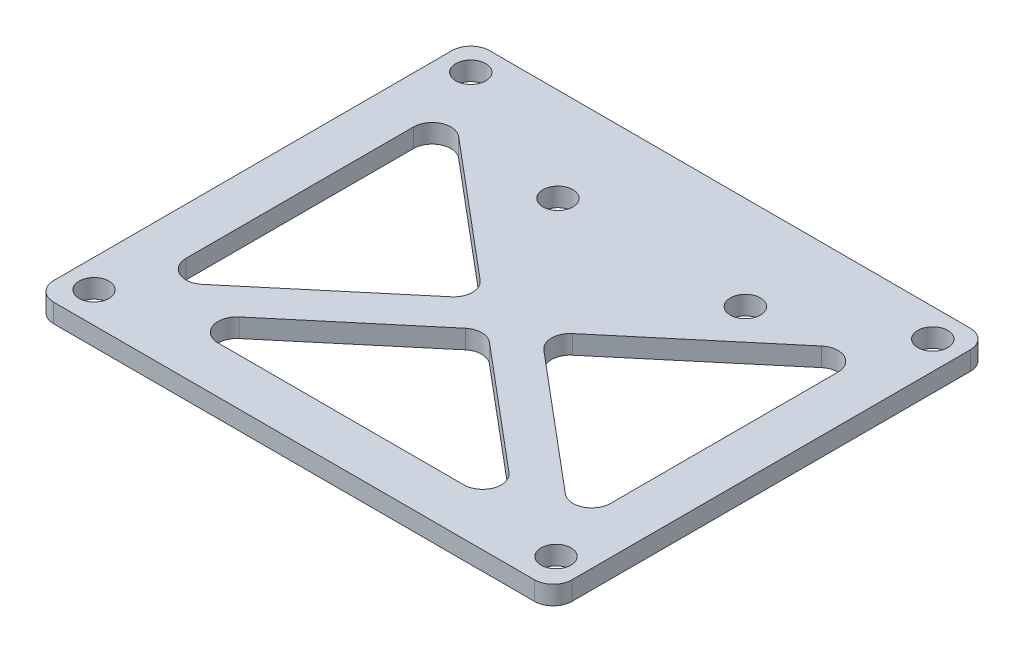
ISO-10303-21;
HEADER;
FILE_DESCRIPTION(('STEP AP214'),'2;1');
FILE_NAME('part.step','',(''),(''),'','','');
FILE_SCHEMA(('AUTOMOTIVE_DESIGN { 1 0 10303 214 1 1 1 1 }'));
ENDSEC;
DATA;
#1=APPLICATION_CONTEXT('core data for automotive mechanical design processes');
#2=APPLICATION_PROTOCOL_DEFINITION('international standard','automotive_design',2000,#1);
#3=PRODUCT_CONTEXT('',#1,'mechanical');
#4=PRODUCT('Part','Part','',(#3));
#5=PRODUCT_RELATED_PRODUCT_CATEGORY('part','',(#4));
#6=PRODUCT_DEFINITION_FORMATION('','',#4);
#7=PRODUCT_DEFINITION_CONTEXT('part definition',#1,'design');
#8=PRODUCT_DEFINITION('design','',#6,#7);
#9=PRODUCT_DEFINITION_SHAPE('','',#8);
#10=(LENGTH_UNIT() NAMED_UNIT(*) SI_UNIT(.MILLI.,.METRE.));
#11=(NAMED_UNIT(*) PLANE_ANGLE_UNIT() SI_UNIT($,.RADIAN.));
#12=(NAMED_UNIT(*) SI_UNIT($,.STERADIAN.) SOLID_ANGLE_UNIT());
#13=UNCERTAINTY_MEASURE_WITH_UNIT(LENGTH_MEASURE(1.E-05),#10,'distance_accuracy_value','');
#14=(GEOMETRIC_REPRESENTATION_CONTEXT(3) GLOBAL_UNCERTAINTY_ASSIGNED_CONTEXT((#13)) GLOBAL_UNIT_ASSIGNED_CONTEXT((#10,
#11,#12)) REPRESENTATION_CONTEXT('',''));
#15=CARTESIAN_POINT('',(0.,0.,0.));
#16=DIRECTION('',(0.,0.,1.));
#17=DIRECTION('',(1.,0.,0.));
#18=AXIS2_PLACEMENT_3D('',#15,#16,#17);
#19=CARTESIAN_POINT('',(0.,2.,0.));
#20=DIRECTION('',(0.,1.,0.));
#21=DIRECTION('',(0.,0.,1.));
#22=AXIS2_PLACEMENT_3D('',#19,#20,#21);
#23=PLANE('',#22);
#24=CARTESIAN_POINT('',(-24.6499999999996,2.,19.9500000000004));
#25=DIRECTION('',(0.,1.,0.));
#26=DIRECTION('',(0.,0.,1.));
#27=AXIS2_PLACEMENT_3D('',#24,#25,#26);
#28=CIRCLE('',#27,1.6);
#29=CARTESIAN_POINT('',(-24.6499999999996,2.,21.5500000000004));
#30=VERTEX_POINT('',#29);
#31=EDGE_CURVE('E396',#30,#30,#28,.T.);
#32=ORIENTED_EDGE('',*,*,#31,.F.);
#33=EDGE_LOOP('',(#32));
#34=FACE_BOUND('',#33,.T.);
#35=CARTESIAN_POINT('',(24.65,2.,-20.25));
#36=DIRECTION('',(0.,1.,0.));
#37=DIRECTION('',(0.,0.,1.));
#38=AXIS2_PLACEMENT_3D('',#35,#36,#37);
#39=CIRCLE('',#38,1.6);
#40=CARTESIAN_POINT('',(24.65,2.,-18.65));
#41=VERTEX_POINT('',#40);
#42=EDGE_CURVE('E408',#41,#41,#39,.T.);
#43=ORIENTED_EDGE('',*,*,#42,.F.);
#44=EDGE_LOOP('',(#43));
#45=FACE_BOUND('',#44,.T.);
#46=CARTESIAN_POINT('',(11.65,2.,-13.25));
#47=DIRECTION('',(0.,1.,0.));
#48=DIRECTION('',(0.,0.,1.));
#49=AXIS2_PLACEMENT_3D('',#46,#47,#48);
#50=CIRCLE('',#49,1.6);
#51=CARTESIAN_POINT('',(11.65,2.,-11.65));
#52=VERTEX_POINT('',#51);
#53=EDGE_CURVE('E420',#52,#52,#50,.T.);
#54=ORIENTED_EDGE('',*,*,#53,.F.);
#55=EDGE_LOOP('',(#54));
#56=FACE_BOUND('',#55,.T.);
#57=DIRECTION('',(0.,0.,1.));
#58=VECTOR('',#57,1.);
#59=CARTESIAN_POINT('',(-27.65,2.,-23.25));
#60=LINE('',#59,#58);
#61=CARTESIAN_POINT('',(-27.65,2.,-21.25));
#62=VERTEX_POINT('',#61);
#63=CARTESIAN_POINT('',(-27.65,2.,21.25));
#64=VERTEX_POINT('',#63);
#65=EDGE_CURVE('E242',#62,#64,#60,.T.);
#66=ORIENTED_EDGE('',*,*,#65,.T.);
#67=CARTESIAN_POINT('',(-25.65,2.,21.25));
#68=DIRECTION('',(0.,1.,0.));
#69=DIRECTION('',(0.,0.,1.));
#70=AXIS2_PLACEMENT_3D('',#67,#68,#69);
#71=CIRCLE('',#70,2.);
#72=CARTESIAN_POINT('',(-25.65,2.,23.25));
#73=VERTEX_POINT('',#72);
#74=EDGE_CURVE('E309',#64,#73,#71,.T.);
#75=ORIENTED_EDGE('',*,*,#74,.T.);
#76=DIRECTION('',(1.,0.,0.));
#77=VECTOR('',#76,1.);
#78=CARTESIAN_POINT('',(-27.65,2.,23.25));
#79=LINE('',#78,#77);
#80=CARTESIAN_POINT('',(25.65,2.,23.25));
#81=VERTEX_POINT('',#80);
#82=EDGE_CURVE('E237',#73,#81,#79,.T.);
#83=ORIENTED_EDGE('',*,*,#82,.T.);
#84=CARTESIAN_POINT('',(25.65,2.,21.25));
#85=DIRECTION('',(0.,1.,0.));
#86=DIRECTION('',(0.,0.,1.));
#87=AXIS2_PLACEMENT_3D('',#84,#85,#86);
#88=CIRCLE('',#87,2.);
#89=CARTESIAN_POINT('',(27.65,2.,21.25));
#90=VERTEX_POINT('',#89);
#91=EDGE_CURVE('E304',#81,#90,#88,.T.);
#92=ORIENTED_EDGE('',*,*,#91,.T.);
#93=DIRECTION('',(0.,0.,-1.));
#94=VECTOR('',#93,1.);
#95=CARTESIAN_POINT('',(27.65,2.,-23.25));
#96=LINE('',#95,#94);
#97=CARTESIAN_POINT('',(27.65,2.,-21.25));
#98=VERTEX_POINT('',#97);
#99=EDGE_CURVE('E426',#90,#98,#96,.T.);
#100=ORIENTED_EDGE('',*,*,#99,.T.);
#101=CARTESIAN_POINT('',(25.65,2.,-21.25));
#102=DIRECTION('',(0.,1.,0.));
#103=DIRECTION('',(0.,0.,1.));
#104=AXIS2_PLACEMENT_3D('',#101,#102,#103);
#105=CIRCLE('',#104,2.);
#106=CARTESIAN_POINT('',(25.65,2.,-23.25));
#107=VERTEX_POINT('',#106);
#108=EDGE_CURVE('E59',#98,#107,#105,.T.);
#109=ORIENTED_EDGE('',*,*,#108,.T.);
#110=DIRECTION('',(-1.,0.,0.));
#111=VECTOR('',#110,1.);
#112=CARTESIAN_POINT('',(-27.65,2.,-23.25));
#113=LINE('',#112,#111);
#114=CARTESIAN_POINT('',(-25.65,2.,-23.25));
#115=VERTEX_POINT('',#114);
#116=EDGE_CURVE('E428',#107,#115,#113,.T.);
#117=ORIENTED_EDGE('',*,*,#116,.T.);
#118=CARTESIAN_POINT('',(-25.65,2.,-21.25));
#119=DIRECTION('',(0.,1.,0.));
#120=DIRECTION('',(0.,0.,1.));
#121=AXIS2_PLACEMENT_3D('',#118,#119,#120);
#122=CIRCLE('',#121,2.);
#123=EDGE_CURVE('E307',#115,#62,#122,.T.);
#124=ORIENTED_EDGE('',*,*,#123,.T.);
#125=EDGE_LOOP('',(#66,#75,#83,#92,#100,#109,#117,#124));
#126=FACE_BOUND('',#125,.T.);
#127=CARTESIAN_POINT('',(-8.35000000000001,2.,-13.25));
#128=DIRECTION('',(0.,1.,0.));
#129=DIRECTION('',(0.,0.,1.));
#130=AXIS2_PLACEMENT_3D('',#127,#128,#129);
#131=CIRCLE('',#130,1.6);
#132=CARTESIAN_POINT('',(-8.35000000000001,2.,-11.65));
#133=VERTEX_POINT('',#132);
#134=EDGE_CURVE('E414',#133,#133,#131,.T.);
#135=ORIENTED_EDGE('',*,*,#134,.F.);
#136=EDGE_LOOP('',(#135));
#137=FACE_BOUND('',#136,.T.);
#138=CARTESIAN_POINT('',(-24.65,2.,-20.2499999999997));
#139=DIRECTION('',(0.,1.,0.));
#140=DIRECTION('',(0.,0.,1.));
#141=AXIS2_PLACEMENT_3D('',#138,#139,#140);
#142=CIRCLE('',#141,1.6);
#143=CARTESIAN_POINT('',(-24.65,2.,-18.6499999999997));
#144=VERTEX_POINT('',#143);
#145=EDGE_CURVE('E402',#144,#144,#142,.T.);
#146=ORIENTED_EDGE('',*,*,#145,.F.);
#147=EDGE_LOOP('',(#146));
#148=FACE_BOUND('',#147,.T.);
#149=CARTESIAN_POINT('',(24.6500000000004,2.,19.95));
#150=DIRECTION('',(0.,1.,0.));
#151=DIRECTION('',(0.,0.,1.));
#152=AXIS2_PLACEMENT_3D('',#149,#150,#151);
#153=CIRCLE('',#152,1.6);
#154=CARTESIAN_POINT('',(24.6500000000004,2.,21.55));
#155=VERTEX_POINT('',#154);
#156=EDGE_CURVE('E390',#155,#155,#153,.T.);
#157=ORIENTED_EDGE('',*,*,#156,.F.);
#158=EDGE_LOOP('',(#157));
#159=FACE_BOUND('',#158,.T.);
#160=DIRECTION('',(-0.765377580301395,0.,-0.643581509656689));
#161=VECTOR('',#160,1.);
#162=CARTESIAN_POINT('',(-3.10760947912701,2.,0.));
#163=LINE('',#162,#161);
#164=CARTESIAN_POINT('',(-4.92805593894065,2.,-1.53075516060279));
#165=VERTEX_POINT('',#164);
#166=CARTESIAN_POINT('',(-19.3628369806866,2.,-13.6685005212029));
#167=VERTEX_POINT('',#166);
#168=EDGE_CURVE('E373',#165,#167,#163,.T.);
#169=ORIENTED_EDGE('',*,*,#168,.F.);
#170=CARTESIAN_POINT('',(-6.21521895825403,2.,0.));
#171=DIRECTION('',(0.,1.,0.));
#172=DIRECTION('',(0.,0.,1.));
#173=AXIS2_PLACEMENT_3D('',#170,#171,#172);
#174=CIRCLE('',#173,2.);
#175=CARTESIAN_POINT('',(-4.92805593894065,2.,1.53075516060279));
#176=VERTEX_POINT('',#175);
#177=EDGE_CURVE('E11',#165,#176,#174,.F.);
#178=ORIENTED_EDGE('',*,*,#177,.T.);
#179=DIRECTION('',(0.765377580301395,0.,-0.643581509656689));
#180=VECTOR('',#179,1.);
#181=CARTESIAN_POINT('',(-3.10760947912701,2.,0.));
#182=LINE('',#181,#180);
#183=CARTESIAN_POINT('',(-19.3628369806866,2.,13.6685005212029));
#184=VERTEX_POINT('',#183);
#185=EDGE_CURVE('E371',#184,#176,#182,.T.);
#186=ORIENTED_EDGE('',*,*,#185,.F.);
#187=CARTESIAN_POINT('',(-20.65,2.,12.1377453606002));
#188=DIRECTION('',(0.,1.,0.));
#189=DIRECTION('',(0.,0.,1.));
#190=AXIS2_PLACEMENT_3D('',#187,#188,#189);
#191=CIRCLE('',#190,2.);
#192=CARTESIAN_POINT('',(-22.65,2.,12.1377453606002));
#193=VERTEX_POINT('',#192);
#194=EDGE_CURVE('E346',#184,#193,#191,.F.);
#195=ORIENTED_EDGE('',*,*,#194,.T.);
#196=DIRECTION('',(0.,0.,1.));
#197=VECTOR('',#196,1.);
#198=CARTESIAN_POINT('',(-22.65,2.,-16.43257069115));
#199=LINE('',#198,#197);
#200=CARTESIAN_POINT('',(-22.65,2.,-12.1377453606002));
#201=VERTEX_POINT('',#200);
#202=EDGE_CURVE('E378',#201,#193,#199,.T.);
#203=ORIENTED_EDGE('',*,*,#202,.F.);
#204=CARTESIAN_POINT('',(-20.65,2.,-12.1377453606002));
#205=DIRECTION('',(0.,1.,0.));
#206=DIRECTION('',(0.,0.,1.));
#207=AXIS2_PLACEMENT_3D('',#204,#205,#206);
#208=CIRCLE('',#207,2.);
#209=EDGE_CURVE('E342',#201,#167,#208,.F.);
#210=ORIENTED_EDGE('',*,*,#209,.T.);
#211=EDGE_LOOP('',(#169,#178,#186,#195,#203,#210));
#212=FACE_BOUND('',#211,.T.);
#213=DIRECTION('',(-0.765377580301395,0.,0.643581509656688));
#214=VECTOR('',#213,1.);
#215=CARTESIAN_POINT('',(0.,2.,2.61308934501639));
#216=LINE('',#215,#214);
#217=CARTESIAN_POINT('',(-1.28716301931337,2.,3.69542352942999));
#218=VERTEX_POINT('',#217);
#219=CARTESIAN_POINT('',(-14.3972128782636,2.,14.7192448393972));
#220=VERTEX_POINT('',#219);
#221=EDGE_CURVE('E832',#218,#220,#216,.T.);
#222=ORIENTED_EDGE('',*,*,#221,.F.);
#223=CARTESIAN_POINT('',(0.,2.,5.22617869003278));
#224=DIRECTION('',(0.,1.,0.));
#225=DIRECTION('',(0.,0.,1.));
#226=AXIS2_PLACEMENT_3D('',#223,#224,#225);
#227=CIRCLE('',#226,2.);
#228=CARTESIAN_POINT('',(1.28716301931338,2.,3.69542352942999));
#229=VERTEX_POINT('',#228);
#230=EDGE_CURVE('E338',#218,#229,#227,.F.);
#231=ORIENTED_EDGE('',*,*,#230,.T.);
#232=DIRECTION('',(-0.765377580301395,0.,-0.643581509656688));
#233=VECTOR('',#232,1.);
#234=CARTESIAN_POINT('',(0.,2.,2.61308934501639));
#235=LINE('',#234,#233);
#236=CARTESIAN_POINT('',(14.3972128782637,2.,14.7192448393972));
#237=VERTEX_POINT('',#236);
#238=EDGE_CURVE('E829',#237,#229,#235,.T.);
#239=ORIENTED_EDGE('',*,*,#238,.F.);
#240=CARTESIAN_POINT('',(13.1100498589503,2.,16.25));
#241=DIRECTION('',(0.,1.,0.));
#242=DIRECTION('',(0.,0.,1.));
#243=AXIS2_PLACEMENT_3D('',#240,#241,#242);
#244=CIRCLE('',#243,2.);
#245=CARTESIAN_POINT('',(13.1100498589503,2.,18.25));
#246=VERTEX_POINT('',#245);
#247=EDGE_CURVE('E334',#237,#246,#244,.F.);
#248=ORIENTED_EDGE('',*,*,#247,.T.);
#249=DIRECTION('',(1.,0.,0.));
#250=VECTOR('',#249,1.);
#251=CARTESIAN_POINT('',(-18.5961539617332,2.,18.25));
#252=LINE('',#251,#250);
#253=CARTESIAN_POINT('',(-13.1100498589503,2.,18.25));
#254=VERTEX_POINT('',#253);
#255=EDGE_CURVE('E388',#254,#246,#252,.T.);
#256=ORIENTED_EDGE('',*,*,#255,.F.);
#257=CARTESIAN_POINT('',(-13.1100498589503,2.,16.25));
#258=DIRECTION('',(0.,1.,0.));
#259=DIRECTION('',(0.,0.,1.));
#260=AXIS2_PLACEMENT_3D('',#257,#258,#259);
#261=CIRCLE('',#260,2.);
#262=EDGE_CURVE('E330',#254,#220,#261,.F.);
#263=ORIENTED_EDGE('',*,*,#262,.T.);
#264=EDGE_LOOP('',(#222,#231,#239,#248,#256,#263));
#265=FACE_BOUND('',#264,.T.);
#266=DIRECTION('',(0.,0.,-1.));
#267=VECTOR('',#266,1.);
#268=CARTESIAN_POINT('',(22.65,2.,-16.43257069115));
#269=LINE('',#268,#267);
#270=CARTESIAN_POINT('',(22.65,2.,12.1377453606002));
#271=VERTEX_POINT('',#270);
#272=CARTESIAN_POINT('',(22.65,2.,-12.1377453606002));
#273=VERTEX_POINT('',#272);
#274=EDGE_CURVE('E820',#271,#273,#269,.T.);
#275=ORIENTED_EDGE('',*,*,#274,.F.);
#276=CARTESIAN_POINT('',(20.65,2.,12.1377453606002));
#277=DIRECTION('',(0.,1.,0.));
#278=DIRECTION('',(0.,0.,1.));
#279=AXIS2_PLACEMENT_3D('',#276,#277,#278);
#280=CIRCLE('',#279,2.);
#281=CARTESIAN_POINT('',(19.3628369806866,2.,13.6685005212029));
#282=VERTEX_POINT('',#281);
#283=EDGE_CURVE('E222',#271,#282,#280,.F.);
#284=ORIENTED_EDGE('',*,*,#283,.T.);
#285=DIRECTION('',(0.765377580301394,0.,0.643581509656689));
#286=VECTOR('',#285,1.);
#287=CARTESIAN_POINT('',(3.10760947912702,2.,0.));
#288=LINE('',#287,#286);
#289=CARTESIAN_POINT('',(4.92805593894066,2.,1.53075516060279));
#290=VERTEX_POINT('',#289);
#291=EDGE_CURVE('E816',#290,#282,#288,.T.);
#292=ORIENTED_EDGE('',*,*,#291,.F.);
#293=CARTESIAN_POINT('',(6.21521895825404,2.,0.));
#294=DIRECTION('',(0.,1.,0.));
#295=DIRECTION('',(0.,0.,1.));
#296=AXIS2_PLACEMENT_3D('',#293,#294,#295);
#297=CIRCLE('',#296,2.);
#298=CARTESIAN_POINT('',(4.92805593894066,2.,-1.53075516060279));
#299=VERTEX_POINT('',#298);
#300=EDGE_CURVE('E223',#290,#299,#297,.F.);
#301=ORIENTED_EDGE('',*,*,#300,.T.);
#302=DIRECTION('',(-0.765377580301394,0.,0.643581509656689));
#303=VECTOR('',#302,1.);
#304=CARTESIAN_POINT('',(3.10760947912702,2.,0.));
#305=LINE('',#304,#303);
#306=CARTESIAN_POINT('',(19.3628369806866,2.,-13.6685005212029));
#307=VERTEX_POINT('',#306);
#308=EDGE_CURVE('E821',#307,#299,#305,.T.);
#309=ORIENTED_EDGE('',*,*,#308,.F.);
#310=CARTESIAN_POINT('',(20.65,2.,-12.1377453606002));
#311=DIRECTION('',(0.,1.,0.));
#312=DIRECTION('',(0.,0.,1.));
#313=AXIS2_PLACEMENT_3D('',#310,#311,#312);
#314=CIRCLE('',#313,2.);
#315=EDGE_CURVE('E322',#307,#273,#314,.F.);
#316=ORIENTED_EDGE('',*,*,#315,.T.);
#317=EDGE_LOOP('',(#275,#284,#292,#301,#309,#316));
#318=FACE_BOUND('',#317,.T.);
#319=ADVANCED_FACE('F37',(#34,#45,#56,#126,#137,#148,#159,#212,#265,#318),#23,.T.);
#320=CARTESIAN_POINT('',(0.,0.,0.));
#321=DIRECTION('',(0.,1.,0.));
#322=DIRECTION('',(0.,0.,1.));
#323=AXIS2_PLACEMENT_3D('',#320,#321,#322);
#324=PLANE('',#323);
#325=DIRECTION('',(1.,0.,0.));
#326=VECTOR('',#325,1.);
#327=CARTESIAN_POINT('',(-18.5961539617332,0.,18.25));
#328=LINE('',#327,#326);
#329=CARTESIAN_POINT('',(-13.1100498589503,0.,18.25));
#330=VERTEX_POINT('',#329);
#331=CARTESIAN_POINT('',(13.1100498589503,0.,18.25));
#332=VERTEX_POINT('',#331);
#333=EDGE_CURVE('E382',#330,#332,#328,.T.);
#334=ORIENTED_EDGE('',*,*,#333,.T.);
#335=CARTESIAN_POINT('',(13.1100498589503,0.,16.25));
#336=DIRECTION('',(0.,1.,0.));
#337=DIRECTION('',(0.,0.,1.));
#338=AXIS2_PLACEMENT_3D('',#335,#336,#337);
#339=CIRCLE('',#338,2.);
#340=CARTESIAN_POINT('',(14.3972128782637,0.,14.7192448393972));
#341=VERTEX_POINT('',#340);
#342=EDGE_CURVE('E332',#332,#341,#339,.T.);
#343=ORIENTED_EDGE('',*,*,#342,.T.);
#344=DIRECTION('',(-0.765377580301395,0.,-0.643581509656688));
#345=VECTOR('',#344,1.);
#346=CARTESIAN_POINT('',(0.,0.,2.61308934501639));
#347=LINE('',#346,#345);
#348=CARTESIAN_POINT('',(1.28716301931338,0.,3.69542352942999));
#349=VERTEX_POINT('',#348);
#350=EDGE_CURVE('E823',#341,#349,#347,.T.);
#351=ORIENTED_EDGE('',*,*,#350,.T.);
#352=CARTESIAN_POINT('',(0.,0.,5.22617869003278));
#353=DIRECTION('',(0.,1.,0.));
#354=DIRECTION('',(0.,0.,1.));
#355=AXIS2_PLACEMENT_3D('',#352,#353,#354);
#356=CIRCLE('',#355,2.);
#357=CARTESIAN_POINT('',(-1.28716301931337,0.,3.69542352942999));
#358=VERTEX_POINT('',#357);
#359=EDGE_CURVE('E336',#349,#358,#356,.T.);
#360=ORIENTED_EDGE('',*,*,#359,.T.);
#361=DIRECTION('',(-0.765377580301395,0.,0.643581509656688));
#362=VECTOR('',#361,1.);
#363=CARTESIAN_POINT('',(0.,0.,2.61308934501639));
#364=LINE('',#363,#362);
#365=CARTESIAN_POINT('',(-14.3972128782636,0.,14.7192448393972));
#366=VERTEX_POINT('',#365);
#367=EDGE_CURVE('E838',#358,#366,#364,.T.);
#368=ORIENTED_EDGE('',*,*,#367,.T.);
#369=CARTESIAN_POINT('',(-13.1100498589503,0.,16.25));
#370=DIRECTION('',(0.,1.,0.));
#371=DIRECTION('',(0.,0.,1.));
#372=AXIS2_PLACEMENT_3D('',#369,#370,#371);
#373=CIRCLE('',#372,2.);
#374=EDGE_CURVE('E328',#366,#330,#373,.T.);
#375=ORIENTED_EDGE('',*,*,#374,.T.);
#376=EDGE_LOOP('',(#334,#343,#351,#360,#368,#375));
#377=FACE_BOUND('',#376,.T.);
#378=CARTESIAN_POINT('',(24.6500000000004,0.,19.95));
#379=DIRECTION('',(0.,1.,0.));
#380=DIRECTION('',(0.,0.,1.));
#381=AXIS2_PLACEMENT_3D('',#378,#379,#380);
#382=CIRCLE('',#381,1.6);
#383=CARTESIAN_POINT('',(24.6500000000004,0.,21.55));
#384=VERTEX_POINT('',#383);
#385=EDGE_CURVE('E387',#384,#384,#382,.T.);
#386=ORIENTED_EDGE('',*,*,#385,.T.);
#387=EDGE_LOOP('',(#386));
#388=FACE_BOUND('',#387,.T.);
#389=CARTESIAN_POINT('',(-24.6499999999996,0.,19.9500000000004));
#390=DIRECTION('',(0.,1.,0.));
#391=DIRECTION('',(0.,0.,1.));
#392=AXIS2_PLACEMENT_3D('',#389,#390,#391);
#393=CIRCLE('',#392,1.6);
#394=CARTESIAN_POINT('',(-24.6499999999996,0.,21.5500000000004));
#395=VERTEX_POINT('',#394);
#396=EDGE_CURVE('E393',#395,#395,#393,.T.);
#397=ORIENTED_EDGE('',*,*,#396,.T.);
#398=EDGE_LOOP('',(#397));
#399=FACE_BOUND('',#398,.T.);
#400=CARTESIAN_POINT('',(-24.65,0.,-20.2499999999997));
#401=DIRECTION('',(0.,1.,0.));
#402=DIRECTION('',(0.,0.,1.));
#403=AXIS2_PLACEMENT_3D('',#400,#401,#402);
#404=CIRCLE('',#403,1.6);
#405=CARTESIAN_POINT('',(-24.65,0.,-18.6499999999997));
#406=VERTEX_POINT('',#405);
#407=EDGE_CURVE('E399',#406,#406,#404,.T.);
#408=ORIENTED_EDGE('',*,*,#407,.T.);
#409=EDGE_LOOP('',(#408));
#410=FACE_BOUND('',#409,.T.);
#411=CARTESIAN_POINT('',(24.65,0.,-20.25));
#412=DIRECTION('',(0.,1.,0.));
#413=DIRECTION('',(0.,0.,1.));
#414=AXIS2_PLACEMENT_3D('',#411,#412,#413);
#415=CIRCLE('',#414,1.6);
#416=CARTESIAN_POINT('',(24.65,0.,-18.65));
#417=VERTEX_POINT('',#416);
#418=EDGE_CURVE('E405',#417,#417,#415,.T.);
#419=ORIENTED_EDGE('',*,*,#418,.T.);
#420=EDGE_LOOP('',(#419));
#421=FACE_BOUND('',#420,.T.);
#422=CARTESIAN_POINT('',(-8.35000000000001,0.,-13.25));
#423=DIRECTION('',(0.,1.,0.));
#424=DIRECTION('',(0.,0.,1.));
#425=AXIS2_PLACEMENT_3D('',#422,#423,#424);
#426=CIRCLE('',#425,1.6);
#427=CARTESIAN_POINT('',(-8.35000000000001,0.,-11.65));
#428=VERTEX_POINT('',#427);
#429=EDGE_CURVE('E411',#428,#428,#426,.T.);
#430=ORIENTED_EDGE('',*,*,#429,.T.);
#431=EDGE_LOOP('',(#430));
#432=FACE_BOUND('',#431,.T.);
#433=CARTESIAN_POINT('',(11.65,0.,-13.25));
#434=DIRECTION('',(0.,1.,0.));
#435=DIRECTION('',(0.,0.,1.));
#436=AXIS2_PLACEMENT_3D('',#433,#434,#435);
#437=CIRCLE('',#436,1.6);
#438=CARTESIAN_POINT('',(11.65,0.,-11.65));
#439=VERTEX_POINT('',#438);
#440=EDGE_CURVE('E417',#439,#439,#437,.T.);
#441=ORIENTED_EDGE('',*,*,#440,.T.);
#442=EDGE_LOOP('',(#441));
#443=FACE_BOUND('',#442,.T.);
#444=DIRECTION('',(1.,0.,0.));
#445=VECTOR('',#444,1.);
#446=CARTESIAN_POINT('',(-27.65,0.,23.25));
#447=LINE('',#446,#445);
#448=CARTESIAN_POINT('',(-25.65,0.,23.25));
#449=VERTEX_POINT('',#448);
#450=CARTESIAN_POINT('',(25.65,0.,23.25));
#451=VERTEX_POINT('',#450);
#452=EDGE_CURVE('E245',#449,#451,#447,.T.);
#453=ORIENTED_EDGE('',*,*,#452,.F.);
#454=CARTESIAN_POINT('',(-25.65,0.,21.25));
#455=DIRECTION('',(0.,1.,0.));
#456=DIRECTION('',(0.,0.,1.));
#457=AXIS2_PLACEMENT_3D('',#454,#455,#456);
#458=CIRCLE('',#457,2.);
#459=CARTESIAN_POINT('',(-27.65,0.,21.25));
#460=VERTEX_POINT('',#459);
#461=EDGE_CURVE('E297',#449,#460,#458,.F.);
#462=ORIENTED_EDGE('',*,*,#461,.T.);
#463=DIRECTION('',(0.,0.,1.));
#464=VECTOR('',#463,1.);
#465=CARTESIAN_POINT('',(-27.65,0.,-23.25));
#466=LINE('',#465,#464);
#467=CARTESIAN_POINT('',(-27.65,0.,-21.25));
#468=VERTEX_POINT('',#467);
#469=EDGE_CURVE('E435',#468,#460,#466,.T.);
#470=ORIENTED_EDGE('',*,*,#469,.F.);
#471=CARTESIAN_POINT('',(-25.65,0.,-21.25));
#472=DIRECTION('',(0.,1.,0.));
#473=DIRECTION('',(0.,0.,1.));
#474=AXIS2_PLACEMENT_3D('',#471,#472,#473);
#475=CIRCLE('',#474,2.);
#476=CARTESIAN_POINT('',(-25.65,0.,-23.25));
#477=VERTEX_POINT('',#476);
#478=EDGE_CURVE('E295',#468,#477,#475,.F.);
#479=ORIENTED_EDGE('',*,*,#478,.T.);
#480=DIRECTION('',(-1.,0.,0.));
#481=VECTOR('',#480,1.);
#482=CARTESIAN_POINT('',(-27.65,0.,-23.25));
#483=LINE('',#482,#481);
#484=CARTESIAN_POINT('',(25.65,0.,-23.25));
#485=VERTEX_POINT('',#484);
#486=EDGE_CURVE('E434',#485,#477,#483,.T.);
#487=ORIENTED_EDGE('',*,*,#486,.F.);
#488=CARTESIAN_POINT('',(25.65,0.,-21.25));
#489=DIRECTION('',(0.,1.,0.));
#490=DIRECTION('',(0.,0.,1.));
#491=AXIS2_PLACEMENT_3D('',#488,#489,#490);
#492=CIRCLE('',#491,2.);
#493=CARTESIAN_POINT('',(27.65,0.,-21.25));
#494=VERTEX_POINT('',#493);
#495=EDGE_CURVE('E293',#485,#494,#492,.F.);
#496=ORIENTED_EDGE('',*,*,#495,.T.);
#497=DIRECTION('',(0.,0.,-1.));
#498=VECTOR('',#497,1.);
#499=CARTESIAN_POINT('',(27.65,0.,-23.25));
#500=LINE('',#499,#498);
#501=CARTESIAN_POINT('',(27.65,0.,21.25));
#502=VERTEX_POINT('',#501);
#503=EDGE_CURVE('E423',#502,#494,#500,.T.);
#504=ORIENTED_EDGE('',*,*,#503,.F.);
#505=CARTESIAN_POINT('',(25.65,0.,21.25));
#506=DIRECTION('',(0.,1.,0.));
#507=DIRECTION('',(0.,0.,1.));
#508=AXIS2_PLACEMENT_3D('',#505,#506,#507);
#509=CIRCLE('',#508,2.);
#510=EDGE_CURVE('E291',#502,#451,#509,.F.);
#511=ORIENTED_EDGE('',*,*,#510,.T.);
#512=EDGE_LOOP('',(#453,#462,#470,#479,#487,#496,#504,#511));
#513=FACE_BOUND('',#512,.T.);
#514=DIRECTION('',(0.,0.,1.));
#515=VECTOR('',#514,1.);
#516=CARTESIAN_POINT('',(-22.65,0.,-16.43257069115));
#517=LINE('',#516,#515);
#518=CARTESIAN_POINT('',(-22.65,0.,-12.1377453606002));
#519=VERTEX_POINT('',#518);
#520=CARTESIAN_POINT('',(-22.65,0.,12.1377453606002));
#521=VERTEX_POINT('',#520);
#522=EDGE_CURVE('E363',#519,#521,#517,.T.);
#523=ORIENTED_EDGE('',*,*,#522,.T.);
#524=CARTESIAN_POINT('',(-20.65,0.,12.1377453606002));
#525=DIRECTION('',(0.,1.,0.));
#526=DIRECTION('',(0.,0.,1.));
#527=AXIS2_PLACEMENT_3D('',#524,#525,#526);
#528=CIRCLE('',#527,2.);
#529=CARTESIAN_POINT('',(-19.3628369806866,0.,13.6685005212029));
#530=VERTEX_POINT('',#529);
#531=EDGE_CURVE('E344',#521,#530,#528,.T.);
#532=ORIENTED_EDGE('',*,*,#531,.T.);
#533=DIRECTION('',(0.765377580301395,0.,-0.643581509656689));
#534=VECTOR('',#533,1.);
#535=CARTESIAN_POINT('',(-3.10760947912701,0.,0.));
#536=LINE('',#535,#534);
#537=CARTESIAN_POINT('',(-4.92805593894065,0.,1.53075516060279));
#538=VERTEX_POINT('',#537);
#539=EDGE_CURVE('E354',#530,#538,#536,.T.);
#540=ORIENTED_EDGE('',*,*,#539,.T.);
#541=CARTESIAN_POINT('',(-6.21521895825403,0.,0.));
#542=DIRECTION('',(0.,1.,0.));
#543=DIRECTION('',(0.,0.,1.));
#544=AXIS2_PLACEMENT_3D('',#541,#542,#543);
#545=CIRCLE('',#544,2.);
#546=CARTESIAN_POINT('',(-4.92805593894065,0.,-1.53075516060279));
#547=VERTEX_POINT('',#546);
#548=EDGE_CURVE('E45',#538,#547,#545,.T.);
#549=ORIENTED_EDGE('',*,*,#548,.T.);
#550=DIRECTION('',(-0.765377580301395,0.,-0.643581509656689));
#551=VECTOR('',#550,1.);
#552=CARTESIAN_POINT('',(-3.10760947912701,0.,0.));
#553=LINE('',#552,#551);
#554=CARTESIAN_POINT('',(-19.3628369806866,0.,-13.6685005212029));
#555=VERTEX_POINT('',#554);
#556=EDGE_CURVE('E352',#547,#555,#553,.T.);
#557=ORIENTED_EDGE('',*,*,#556,.T.);
#558=CARTESIAN_POINT('',(-20.65,0.,-12.1377453606002));
#559=DIRECTION('',(0.,1.,0.));
#560=DIRECTION('',(0.,0.,1.));
#561=AXIS2_PLACEMENT_3D('',#558,#559,#560);
#562=CIRCLE('',#561,2.);
#563=EDGE_CURVE('E340',#555,#519,#562,.T.);
#564=ORIENTED_EDGE('',*,*,#563,.T.);
#565=EDGE_LOOP('',(#523,#532,#540,#549,#557,#564));
#566=FACE_BOUND('',#565,.T.);
#567=DIRECTION('',(-0.765377580301394,0.,0.643581509656689));
#568=VECTOR('',#567,1.);
#569=CARTESIAN_POINT('',(3.10760947912702,0.,0.));
#570=LINE('',#569,#568);
#571=CARTESIAN_POINT('',(19.3628369806866,0.,-13.6685005212029));
#572=VERTEX_POINT('',#571);
#573=CARTESIAN_POINT('',(4.92805593894066,0.,-1.53075516060279));
#574=VERTEX_POINT('',#573);
#575=EDGE_CURVE('E233',#572,#574,#570,.T.);
#576=ORIENTED_EDGE('',*,*,#575,.T.);
#577=CARTESIAN_POINT('',(6.21521895825404,0.,0.));
#578=DIRECTION('',(0.,1.,0.));
#579=DIRECTION('',(0.,0.,1.));
#580=AXIS2_PLACEMENT_3D('',#577,#578,#579);
#581=CIRCLE('',#580,2.);
#582=CARTESIAN_POINT('',(4.92805593894066,0.,1.53075516060279));
#583=VERTEX_POINT('',#582);
#584=EDGE_CURVE('E324',#574,#583,#581,.T.);
#585=ORIENTED_EDGE('',*,*,#584,.T.);
#586=DIRECTION('',(0.765377580301394,0.,0.643581509656689));
#587=VECTOR('',#586,1.);
#588=CARTESIAN_POINT('',(3.10760947912702,0.,0.));
#589=LINE('',#588,#587);
#590=CARTESIAN_POINT('',(19.3628369806866,0.,13.6685005212029));
#591=VERTEX_POINT('',#590);
#592=EDGE_CURVE('E217',#583,#591,#589,.T.);
#593=ORIENTED_EDGE('',*,*,#592,.T.);
#594=CARTESIAN_POINT('',(20.65,0.,12.1377453606002));
#595=DIRECTION('',(0.,1.,0.));
#596=DIRECTION('',(0.,0.,1.));
#597=AXIS2_PLACEMENT_3D('',#594,#595,#596);
#598=CIRCLE('',#597,2.);
#599=CARTESIAN_POINT('',(22.65,0.,12.1377453606002));
#600=VERTEX_POINT('',#599);
#601=EDGE_CURVE('E211',#591,#600,#598,.T.);
#602=ORIENTED_EDGE('',*,*,#601,.T.);
#603=DIRECTION('',(0.,0.,-1.));
#604=VECTOR('',#603,1.);
#605=CARTESIAN_POINT('',(22.65,0.,-16.43257069115));
#606=LINE('',#605,#604);
#607=CARTESIAN_POINT('',(22.65,0.,-12.1377453606002));
#608=VERTEX_POINT('',#607);
#609=EDGE_CURVE('E215',#600,#608,#606,.T.);
#610=ORIENTED_EDGE('',*,*,#609,.T.);
#611=CARTESIAN_POINT('',(20.65,0.,-12.1377453606002));
#612=DIRECTION('',(0.,1.,0.));
#613=DIRECTION('',(0.,0.,1.));
#614=AXIS2_PLACEMENT_3D('',#611,#612,#613);
#615=CIRCLE('',#614,2.);
#616=EDGE_CURVE('E320',#608,#572,#615,.T.);
#617=ORIENTED_EDGE('',*,*,#616,.T.);
#618=EDGE_LOOP('',(#576,#585,#593,#602,#610,#617));
#619=FACE_BOUND('',#618,.T.);
#620=ADVANCED_FACE('F214',(#377,#388,#399,#410,#421,#432,#443,#513,#566,#619),#324,.F.);
#621=CARTESIAN_POINT('',(27.65,2.,-23.25));
#622=DIRECTION('',(-1.,0.,0.));
#623=DIRECTION('',(0.,0.,1.));
#624=AXIS2_PLACEMENT_3D('',#621,#622,#623);
#625=PLANE('',#624);
#626=ORIENTED_EDGE('',*,*,#503,.T.);
#627=DIRECTION('',(0.,-1.,0.));
#628=VECTOR('',#627,1.);
#629=CARTESIAN_POINT('',(27.65,2.,-21.25));
#630=LINE('',#629,#628);
#631=EDGE_CURVE('E318',#494,#98,#630,.F.);
#632=ORIENTED_EDGE('',*,*,#631,.T.);
#633=ORIENTED_EDGE('',*,*,#99,.F.);
#634=DIRECTION('',(0.,-1.,0.));
#635=VECTOR('',#634,1.);
#636=CARTESIAN_POINT('',(27.65,2.,21.25));
#637=LINE('',#636,#635);
#638=EDGE_CURVE('E315',#90,#502,#637,.T.);
#639=ORIENTED_EDGE('',*,*,#638,.T.);
#640=EDGE_LOOP('',(#626,#632,#633,#639));
#641=FACE_BOUND('',#640,.T.);
#642=ADVANCED_FACE('F454',(#641),#625,.F.);
#643=CARTESIAN_POINT('',(-27.65,2.,-23.25));
#644=DIRECTION('',(0.,0.,1.));
#645=DIRECTION('',(1.,0.,0.));
#646=AXIS2_PLACEMENT_3D('',#643,#644,#645);
#647=PLANE('',#646);
#648=ORIENTED_EDGE('',*,*,#486,.T.);
#649=DIRECTION('',(0.,-1.,0.));
#650=VECTOR('',#649,1.);
#651=CARTESIAN_POINT('',(-25.65,2.,-23.25));
#652=LINE('',#651,#650);
#653=EDGE_CURVE('E52',#477,#115,#652,.F.);
#654=ORIENTED_EDGE('',*,*,#653,.T.);
#655=ORIENTED_EDGE('',*,*,#116,.F.);
#656=DIRECTION('',(0.,-1.,0.));
#657=VECTOR('',#656,1.);
#658=CARTESIAN_POINT('',(25.65,2.,-23.25));
#659=LINE('',#658,#657);
#660=EDGE_CURVE('E311',#107,#485,#659,.T.);
#661=ORIENTED_EDGE('',*,*,#660,.T.);
#662=EDGE_LOOP('',(#648,#654,#655,#661));
#663=FACE_BOUND('',#662,.T.);
#664=ADVANCED_FACE('F461',(#663),#647,.F.);
#665=CARTESIAN_POINT('',(-27.65,2.,-23.25));
#666=DIRECTION('',(1.,0.,0.));
#667=DIRECTION('',(0.,0.,-1.));
#668=AXIS2_PLACEMENT_3D('',#665,#666,#667);
#669=PLANE('',#668);
#670=ORIENTED_EDGE('',*,*,#469,.T.);
#671=DIRECTION('',(0.,-1.,0.));
#672=VECTOR('',#671,1.);
#673=CARTESIAN_POINT('',(-27.65,2.,21.25));
#674=LINE('',#673,#672);
#675=EDGE_CURVE('E302',#460,#64,#674,.F.);
#676=ORIENTED_EDGE('',*,*,#675,.T.);
#677=ORIENTED_EDGE('',*,*,#65,.F.);
#678=DIRECTION('',(0.,-1.,0.));
#679=VECTOR('',#678,1.);
#680=CARTESIAN_POINT('',(-27.65,2.,-21.25));
#681=LINE('',#680,#679);
#682=EDGE_CURVE('E299',#62,#468,#681,.T.);
#683=ORIENTED_EDGE('',*,*,#682,.T.);
#684=EDGE_LOOP('',(#670,#676,#677,#683));
#685=FACE_BOUND('',#684,.T.);
#686=ADVANCED_FACE('F467',(#685),#669,.F.);
#687=CARTESIAN_POINT('',(-27.65,2.,23.25));
#688=DIRECTION('',(0.,0.,-1.));
#689=DIRECTION('',(-1.,0.,0.));
#690=AXIS2_PLACEMENT_3D('',#687,#688,#689);
#691=PLANE('',#690);
#692=ORIENTED_EDGE('',*,*,#82,.F.);
#693=DIRECTION('',(0.,-1.,0.));
#694=VECTOR('',#693,1.);
#695=CARTESIAN_POINT('',(-25.65,2.,23.25));
#696=LINE('',#695,#694);
#697=EDGE_CURVE('E288',#73,#449,#696,.T.);
#698=ORIENTED_EDGE('',*,*,#697,.T.);
#699=ORIENTED_EDGE('',*,*,#452,.T.);
#700=DIRECTION('',(0.,-1.,0.));
#701=VECTOR('',#700,1.);
#702=CARTESIAN_POINT('',(25.65,2.,23.25));
#703=LINE('',#702,#701);
#704=EDGE_CURVE('E286',#451,#81,#703,.F.);
#705=ORIENTED_EDGE('',*,*,#704,.T.);
#706=EDGE_LOOP('',(#692,#698,#699,#705));
#707=FACE_BOUND('',#706,.T.);
#708=ADVANCED_FACE('F445',(#707),#691,.F.);
#709=CARTESIAN_POINT('',(11.65,2.,-13.25));
#710=DIRECTION('',(0.,-1.,0.));
#711=DIRECTION('',(0.,0.,-1.));
#712=AXIS2_PLACEMENT_3D('',#709,#710,#711);
#713=CYLINDRICAL_SURFACE('',#712,1.6);
#714=ORIENTED_EDGE('',*,*,#53,.T.);
#715=EDGE_LOOP('',(#714));
#716=FACE_BOUND('',#715,.T.);
#717=ORIENTED_EDGE('',*,*,#440,.F.);
#718=EDGE_LOOP('',(#717));
#719=FACE_BOUND('',#718,.T.);
#720=ADVANCED_FACE('F491',(#716,#719),#713,.F.);
#721=CARTESIAN_POINT('',(-8.35000000000001,2.,-13.25));
#722=DIRECTION('',(0.,-1.,0.));
#723=DIRECTION('',(0.,0.,-1.));
#724=AXIS2_PLACEMENT_3D('',#721,#722,#723);
#725=CYLINDRICAL_SURFACE('',#724,1.6);
#726=ORIENTED_EDGE('',*,*,#134,.T.);
#727=EDGE_LOOP('',(#726));
#728=FACE_BOUND('',#727,.T.);
#729=ORIENTED_EDGE('',*,*,#429,.F.);
#730=EDGE_LOOP('',(#729));
#731=FACE_BOUND('',#730,.T.);
#732=ADVANCED_FACE('F569',(#728,#731),#725,.F.);
#733=CARTESIAN_POINT('',(24.65,2.,-20.25));
#734=DIRECTION('',(0.,-1.,0.));
#735=DIRECTION('',(0.,0.,-1.));
#736=AXIS2_PLACEMENT_3D('',#733,#734,#735);
#737=CYLINDRICAL_SURFACE('',#736,1.6);
#738=ORIENTED_EDGE('',*,*,#42,.T.);
#739=EDGE_LOOP('',(#738));
#740=FACE_BOUND('',#739,.T.);
#741=ORIENTED_EDGE('',*,*,#418,.F.);
#742=EDGE_LOOP('',(#741));
#743=FACE_BOUND('',#742,.T.);
#744=ADVANCED_FACE('F566',(#740,#743),#737,.F.);
#745=CARTESIAN_POINT('',(-24.65,2.,-20.2499999999997));
#746=DIRECTION('',(0.,-1.,0.));
#747=DIRECTION('',(0.,0.,-1.));
#748=AXIS2_PLACEMENT_3D('',#745,#746,#747);
#749=CYLINDRICAL_SURFACE('',#748,1.6);
#750=ORIENTED_EDGE('',*,*,#145,.T.);
#751=EDGE_LOOP('',(#750));
#752=FACE_BOUND('',#751,.T.);
#753=ORIENTED_EDGE('',*,*,#407,.F.);
#754=EDGE_LOOP('',(#753));
#755=FACE_BOUND('',#754,.T.);
#756=ADVANCED_FACE('F562',(#752,#755),#749,.F.);
#757=CARTESIAN_POINT('',(-24.6499999999996,2.,19.9500000000004));
#758=DIRECTION('',(0.,-1.,0.));
#759=DIRECTION('',(0.,0.,-1.));
#760=AXIS2_PLACEMENT_3D('',#757,#758,#759);
#761=CYLINDRICAL_SURFACE('',#760,1.6);
#762=ORIENTED_EDGE('',*,*,#31,.T.);
#763=EDGE_LOOP('',(#762));
#764=FACE_BOUND('',#763,.T.);
#765=ORIENTED_EDGE('',*,*,#396,.F.);
#766=EDGE_LOOP('',(#765));
#767=FACE_BOUND('',#766,.T.);
#768=ADVANCED_FACE('F558',(#764,#767),#761,.F.);
#769=CARTESIAN_POINT('',(24.6500000000004,2.,19.95));
#770=DIRECTION('',(0.,-1.,0.));
#771=DIRECTION('',(0.,0.,-1.));
#772=AXIS2_PLACEMENT_3D('',#769,#770,#771);
#773=CYLINDRICAL_SURFACE('',#772,1.6);
#774=ORIENTED_EDGE('',*,*,#156,.T.);
#775=EDGE_LOOP('',(#774));
#776=FACE_BOUND('',#775,.T.);
#777=ORIENTED_EDGE('',*,*,#385,.F.);
#778=EDGE_LOOP('',(#777));
#779=FACE_BOUND('',#778,.T.);
#780=ADVANCED_FACE('F555',(#776,#779),#773,.F.);
#781=CARTESIAN_POINT('',(-3.10760947912701,2.,0.));
#782=DIRECTION('',(-0.643581509656689,0.,-0.765377580301395));
#783=DIRECTION('',(-0.765377580301394,0.,0.643581509656689));
#784=AXIS2_PLACEMENT_3D('',#781,#782,#783);
#785=PLANE('',#784);
#786=ORIENTED_EDGE('',*,*,#539,.F.);
#787=DIRECTION('',(0.,-1.,0.));
#788=VECTOR('',#787,1.);
#789=CARTESIAN_POINT('',(-19.3628369806866,2.,13.6685005212029));
#790=LINE('',#789,#788);
#791=EDGE_CURVE('E284',#530,#184,#790,.F.);
#792=ORIENTED_EDGE('',*,*,#791,.T.);
#793=ORIENTED_EDGE('',*,*,#185,.T.);
#794=DIRECTION('',(0.,-1.,0.));
#795=VECTOR('',#794,1.);
#796=CARTESIAN_POINT('',(-4.92805593894065,0.,1.53075516060279));
#797=LINE('',#796,#795);
#798=EDGE_CURVE('E281',#176,#538,#797,.T.);
#799=ORIENTED_EDGE('',*,*,#798,.T.);
#800=EDGE_LOOP('',(#786,#792,#793,#799));
#801=FACE_BOUND('',#800,.T.);
#802=ADVANCED_FACE('F375',(#801),#785,.T.);
#803=CARTESIAN_POINT('',(-3.10760947912701,2.,0.));
#804=DIRECTION('',(-0.643581509656689,0.,0.765377580301395));
#805=DIRECTION('',(0.765377580301394,0.,0.643581509656689));
#806=AXIS2_PLACEMENT_3D('',#803,#804,#805);
#807=PLANE('',#806);
#808=ORIENTED_EDGE('',*,*,#168,.T.);
#809=DIRECTION('',(0.,-1.,0.));
#810=VECTOR('',#809,1.);
#811=CARTESIAN_POINT('',(-19.3628369806866,0.,-13.6685005212029));
#812=LINE('',#811,#810);
#813=EDGE_CURVE('E273',#167,#555,#812,.T.);
#814=ORIENTED_EDGE('',*,*,#813,.T.);
#815=ORIENTED_EDGE('',*,*,#556,.F.);
#816=DIRECTION('',(0.,-1.,0.));
#817=VECTOR('',#816,1.);
#818=CARTESIAN_POINT('',(-4.92805593894065,2.,-1.53075516060279));
#819=LINE('',#818,#817);
#820=EDGE_CURVE('E271',#547,#165,#819,.F.);
#821=ORIENTED_EDGE('',*,*,#820,.T.);
#822=EDGE_LOOP('',(#808,#814,#815,#821));
#823=FACE_BOUND('',#822,.T.);
#824=ADVANCED_FACE('F360',(#823),#807,.T.);
#825=CARTESIAN_POINT('',(-22.65,2.,-16.43257069115));
#826=DIRECTION('',(1.,0.,0.));
#827=DIRECTION('',(0.,0.,-1.));
#828=AXIS2_PLACEMENT_3D('',#825,#826,#827);
#829=PLANE('',#828);
#830=ORIENTED_EDGE('',*,*,#522,.F.);
#831=DIRECTION('',(0.,-1.,0.));
#832=VECTOR('',#831,1.);
#833=CARTESIAN_POINT('',(-22.65,2.,-12.1377453606002));
#834=LINE('',#833,#832);
#835=EDGE_CURVE('E279',#519,#201,#834,.F.);
#836=ORIENTED_EDGE('',*,*,#835,.T.);
#837=ORIENTED_EDGE('',*,*,#202,.T.);
#838=DIRECTION('',(0.,-1.,0.));
#839=VECTOR('',#838,1.);
#840=CARTESIAN_POINT('',(-22.65,0.,12.1377453606002));
#841=LINE('',#840,#839);
#842=EDGE_CURVE('E276',#193,#521,#841,.T.);
#843=ORIENTED_EDGE('',*,*,#842,.T.);
#844=EDGE_LOOP('',(#830,#836,#837,#843));
#845=FACE_BOUND('',#844,.T.);
#846=ADVANCED_FACE('F538',(#845),#829,.T.);
#847=CARTESIAN_POINT('',(0.,2.,2.61308934501639));
#848=DIRECTION('',(-0.643581509656688,0.,0.765377580301395));
#849=DIRECTION('',(0.765377580301395,0.,0.643581509656688));
#850=AXIS2_PLACEMENT_3D('',#847,#848,#849);
#851=PLANE('',#850);
#852=ORIENTED_EDGE('',*,*,#350,.F.);
#853=DIRECTION('',(0.,-1.,0.));
#854=VECTOR('',#853,1.);
#855=CARTESIAN_POINT('',(14.3972128782637,2.,14.7192448393972));
#856=LINE('',#855,#854);
#857=EDGE_CURVE('E269',#341,#237,#856,.F.);
#858=ORIENTED_EDGE('',*,*,#857,.T.);
#859=ORIENTED_EDGE('',*,*,#238,.T.);
#860=DIRECTION('',(0.,-1.,0.));
#861=VECTOR('',#860,1.);
#862=CARTESIAN_POINT('',(1.28716301931338,0.,3.69542352942999));
#863=LINE('',#862,#861);
#864=EDGE_CURVE('E266',#229,#349,#863,.T.);
#865=ORIENTED_EDGE('',*,*,#864,.T.);
#866=EDGE_LOOP('',(#852,#858,#859,#865));
#867=FACE_BOUND('',#866,.T.);
#868=ADVANCED_FACE('F541',(#867),#851,.T.);
#869=CARTESIAN_POINT('',(0.,2.,2.61308934501639));
#870=DIRECTION('',(0.643581509656688,0.,0.765377580301395));
#871=DIRECTION('',(0.765377580301395,0.,-0.643581509656688));
#872=AXIS2_PLACEMENT_3D('',#869,#870,#871);
#873=PLANE('',#872);
#874=ORIENTED_EDGE('',*,*,#221,.T.);
#875=DIRECTION('',(0.,-1.,0.));
#876=VECTOR('',#875,1.);
#877=CARTESIAN_POINT('',(-14.3972128782636,0.,14.7192448393972));
#878=LINE('',#877,#876);
#879=EDGE_CURVE('E258',#220,#366,#878,.T.);
#880=ORIENTED_EDGE('',*,*,#879,.T.);
#881=ORIENTED_EDGE('',*,*,#367,.F.);
#882=DIRECTION('',(0.,-1.,0.));
#883=VECTOR('',#882,1.);
#884=CARTESIAN_POINT('',(-1.28716301931337,2.,3.69542352942999));
#885=LINE('',#884,#883);
#886=EDGE_CURVE('E256',#358,#218,#885,.F.);
#887=ORIENTED_EDGE('',*,*,#886,.T.);
#888=EDGE_LOOP('',(#874,#880,#881,#887));
#889=FACE_BOUND('',#888,.T.);
#890=ADVANCED_FACE('F547',(#889),#873,.T.);
#891=CARTESIAN_POINT('',(-18.5961539617332,2.,18.25));
#892=DIRECTION('',(0.,0.,-1.));
#893=DIRECTION('',(-1.,0.,0.));
#894=AXIS2_PLACEMENT_3D('',#891,#892,#893);
#895=PLANE('',#894);
#896=ORIENTED_EDGE('',*,*,#333,.F.);
#897=DIRECTION('',(0.,-1.,0.));
#898=VECTOR('',#897,1.);
#899=CARTESIAN_POINT('',(-13.1100498589503,2.,18.25));
#900=LINE('',#899,#898);
#901=EDGE_CURVE('E264',#330,#254,#900,.F.);
#902=ORIENTED_EDGE('',*,*,#901,.T.);
#903=ORIENTED_EDGE('',*,*,#255,.T.);
#904=DIRECTION('',(0.,-1.,0.));
#905=VECTOR('',#904,1.);
#906=CARTESIAN_POINT('',(13.1100498589503,0.,18.25));
#907=LINE('',#906,#905);
#908=EDGE_CURVE('E261',#246,#332,#907,.T.);
#909=ORIENTED_EDGE('',*,*,#908,.T.);
#910=EDGE_LOOP('',(#896,#902,#903,#909));
#911=FACE_BOUND('',#910,.T.);
#912=ADVANCED_FACE('F695',(#911),#895,.T.);
#913=CARTESIAN_POINT('',(3.10760947912702,2.,0.));
#914=DIRECTION('',(0.643581509656689,0.,-0.765377580301394));
#915=DIRECTION('',(-0.765377580301394,0.,-0.643581509656689));
#916=AXIS2_PLACEMENT_3D('',#913,#914,#915);
#917=PLANE('',#916);
#918=ORIENTED_EDGE('',*,*,#592,.F.);
#919=DIRECTION('',(0.,-1.,0.));
#920=VECTOR('',#919,1.);
#921=CARTESIAN_POINT('',(4.92805593894066,2.,1.53075516060279));
#922=LINE('',#921,#920);
#923=EDGE_CURVE('E254',#583,#290,#922,.F.);
#924=ORIENTED_EDGE('',*,*,#923,.T.);
#925=ORIENTED_EDGE('',*,*,#291,.T.);
#926=DIRECTION('',(0.,-1.,0.));
#927=VECTOR('',#926,1.);
#928=CARTESIAN_POINT('',(19.3628369806866,0.,13.6685005212029));
#929=LINE('',#928,#927);
#930=EDGE_CURVE('E252',#282,#591,#929,.T.);
#931=ORIENTED_EDGE('',*,*,#930,.T.);
#932=EDGE_LOOP('',(#918,#924,#925,#931));
#933=FACE_BOUND('',#932,.T.);
#934=ADVANCED_FACE('F704',(#933),#917,.T.);
#935=CARTESIAN_POINT('',(22.65,2.,-16.43257069115));
#936=DIRECTION('',(-1.,0.,0.));
#937=DIRECTION('',(0.,0.,1.));
#938=AXIS2_PLACEMENT_3D('',#935,#936,#937);
#939=PLANE('',#938);
#940=ORIENTED_EDGE('',*,*,#274,.T.);
#941=DIRECTION('',(0.,-1.,0.));
#942=VECTOR('',#941,1.);
#943=CARTESIAN_POINT('',(22.65,0.,-12.1377453606002));
#944=LINE('',#943,#942);
#945=EDGE_CURVE('E232',#273,#608,#944,.T.);
#946=ORIENTED_EDGE('',*,*,#945,.T.);
#947=ORIENTED_EDGE('',*,*,#609,.F.);
#948=DIRECTION('',(0.,-1.,0.));
#949=VECTOR('',#948,1.);
#950=CARTESIAN_POINT('',(22.65,2.,12.1377453606002));
#951=LINE('',#950,#949);
#952=EDGE_CURVE('E229',#600,#271,#951,.F.);
#953=ORIENTED_EDGE('',*,*,#952,.T.);
#954=EDGE_LOOP('',(#940,#946,#947,#953));
#955=FACE_BOUND('',#954,.T.);
#956=ADVANCED_FACE('F228',(#955),#939,.T.);
#957=CARTESIAN_POINT('',(3.10760947912702,2.,0.));
#958=DIRECTION('',(0.643581509656689,0.,0.765377580301394));
#959=DIRECTION('',(0.765377580301394,0.,-0.643581509656689));
#960=AXIS2_PLACEMENT_3D('',#957,#958,#959);
#961=PLANE('',#960);
#962=ORIENTED_EDGE('',*,*,#575,.F.);
#963=DIRECTION('',(0.,-1.,0.));
#964=VECTOR('',#963,1.);
#965=CARTESIAN_POINT('',(19.3628369806866,2.,-13.668500521203));
#966=LINE('',#965,#964);
#967=EDGE_CURVE('E250',#572,#307,#966,.F.);
#968=ORIENTED_EDGE('',*,*,#967,.T.);
#969=ORIENTED_EDGE('',*,*,#308,.T.);
#970=DIRECTION('',(0.,-1.,0.));
#971=VECTOR('',#970,1.);
#972=CARTESIAN_POINT('',(4.92805593894066,0.,-1.53075516060279));
#973=LINE('',#972,#971);
#974=EDGE_CURVE('E239',#299,#574,#973,.T.);
#975=ORIENTED_EDGE('',*,*,#974,.T.);
#976=EDGE_LOOP('',(#962,#968,#969,#975));
#977=FACE_BOUND('',#976,.T.);
#978=ADVANCED_FACE('F506',(#977),#961,.T.);
#979=CARTESIAN_POINT('',(20.65,2.,-12.1377453606002));
#980=DIRECTION('',(0.,1.,0.));
#981=DIRECTION('',(0.,0.,1.));
#982=AXIS2_PLACEMENT_3D('',#979,#980,#981);
#983=CYLINDRICAL_SURFACE('',#982,2.);
#984=ORIENTED_EDGE('',*,*,#315,.F.);
#985=ORIENTED_EDGE('',*,*,#967,.F.);
#986=ORIENTED_EDGE('',*,*,#616,.F.);
#987=ORIENTED_EDGE('',*,*,#945,.F.);
#988=EDGE_LOOP('',(#984,#985,#986,#987));
#989=FACE_BOUND('',#988,.T.);
#990=ADVANCED_FACE('F502',(#989),#983,.F.);
#991=CARTESIAN_POINT('',(6.21521895825404,2.,0.));
#992=DIRECTION('',(0.,1.,0.));
#993=DIRECTION('',(0.,0.,1.));
#994=AXIS2_PLACEMENT_3D('',#991,#992,#993);
#995=CYLINDRICAL_SURFACE('',#994,2.);
#996=ORIENTED_EDGE('',*,*,#300,.F.);
#997=ORIENTED_EDGE('',*,*,#923,.F.);
#998=ORIENTED_EDGE('',*,*,#584,.F.);
#999=ORIENTED_EDGE('',*,*,#974,.F.);
#1000=EDGE_LOOP('',(#996,#997,#998,#999));
#1001=FACE_BOUND('',#1000,.T.);
#1002=ADVANCED_FACE('F505',(#1001),#995,.F.);
#1003=CARTESIAN_POINT('',(20.65,2.,12.1377453606002));
#1004=DIRECTION('',(0.,1.,0.));
#1005=DIRECTION('',(0.,0.,1.));
#1006=AXIS2_PLACEMENT_3D('',#1003,#1004,#1005);
#1007=CYLINDRICAL_SURFACE('',#1006,2.);
#1008=ORIENTED_EDGE('',*,*,#283,.F.);
#1009=ORIENTED_EDGE('',*,*,#952,.F.);
#1010=ORIENTED_EDGE('',*,*,#601,.F.);
#1011=ORIENTED_EDGE('',*,*,#930,.F.);
#1012=EDGE_LOOP('',(#1008,#1009,#1010,#1011));
#1013=FACE_BOUND('',#1012,.T.);
#1014=ADVANCED_FACE('F236',(#1013),#1007,.F.);
#1015=CARTESIAN_POINT('',(-13.1100498589503,2.,16.25));
#1016=DIRECTION('',(0.,1.,0.));
#1017=DIRECTION('',(0.,0.,1.));
#1018=AXIS2_PLACEMENT_3D('',#1015,#1016,#1017);
#1019=CYLINDRICAL_SURFACE('',#1018,2.);
#1020=ORIENTED_EDGE('',*,*,#262,.F.);
#1021=ORIENTED_EDGE('',*,*,#901,.F.);
#1022=ORIENTED_EDGE('',*,*,#374,.F.);
#1023=ORIENTED_EDGE('',*,*,#879,.F.);
#1024=EDGE_LOOP('',(#1020,#1021,#1022,#1023));
#1025=FACE_BOUND('',#1024,.T.);
#1026=ADVANCED_FACE('F513',(#1025),#1019,.F.);
#1027=CARTESIAN_POINT('',(13.1100498589503,2.,16.25));
#1028=DIRECTION('',(0.,1.,0.));
#1029=DIRECTION('',(0.,0.,1.));
#1030=AXIS2_PLACEMENT_3D('',#1027,#1028,#1029);
#1031=CYLINDRICAL_SURFACE('',#1030,2.);
#1032=ORIENTED_EDGE('',*,*,#247,.F.);
#1033=ORIENTED_EDGE('',*,*,#857,.F.);
#1034=ORIENTED_EDGE('',*,*,#342,.F.);
#1035=ORIENTED_EDGE('',*,*,#908,.F.);
#1036=EDGE_LOOP('',(#1032,#1033,#1034,#1035));
#1037=FACE_BOUND('',#1036,.T.);
#1038=ADVANCED_FACE('F516',(#1037),#1031,.F.);
#1039=CARTESIAN_POINT('',(0.,2.,5.22617869003278));
#1040=DIRECTION('',(0.,1.,0.));
#1041=DIRECTION('',(0.,0.,1.));
#1042=AXIS2_PLACEMENT_3D('',#1039,#1040,#1041);
#1043=CYLINDRICAL_SURFACE('',#1042,2.);
#1044=ORIENTED_EDGE('',*,*,#230,.F.);
#1045=ORIENTED_EDGE('',*,*,#886,.F.);
#1046=ORIENTED_EDGE('',*,*,#359,.F.);
#1047=ORIENTED_EDGE('',*,*,#864,.F.);
#1048=EDGE_LOOP('',(#1044,#1045,#1046,#1047));
#1049=FACE_BOUND('',#1048,.T.);
#1050=ADVANCED_FACE('F520',(#1049),#1043,.F.);
#1051=CARTESIAN_POINT('',(-20.65,2.,-12.1377453606002));
#1052=DIRECTION('',(0.,1.,0.));
#1053=DIRECTION('',(0.,0.,1.));
#1054=AXIS2_PLACEMENT_3D('',#1051,#1052,#1053);
#1055=CYLINDRICAL_SURFACE('',#1054,2.);
#1056=ORIENTED_EDGE('',*,*,#209,.F.);
#1057=ORIENTED_EDGE('',*,*,#835,.F.);
#1058=ORIENTED_EDGE('',*,*,#563,.F.);
#1059=ORIENTED_EDGE('',*,*,#813,.F.);
#1060=EDGE_LOOP('',(#1056,#1057,#1058,#1059));
#1061=FACE_BOUND('',#1060,.T.);
#1062=ADVANCED_FACE('F524',(#1061),#1055,.F.);
#1063=CARTESIAN_POINT('',(-20.65,2.,12.1377453606002));
#1064=DIRECTION('',(0.,1.,0.));
#1065=DIRECTION('',(0.,0.,1.));
#1066=AXIS2_PLACEMENT_3D('',#1063,#1064,#1065);
#1067=CYLINDRICAL_SURFACE('',#1066,2.);
#1068=ORIENTED_EDGE('',*,*,#194,.F.);
#1069=ORIENTED_EDGE('',*,*,#791,.F.);
#1070=ORIENTED_EDGE('',*,*,#531,.F.);
#1071=ORIENTED_EDGE('',*,*,#842,.F.);
#1072=EDGE_LOOP('',(#1068,#1069,#1070,#1071));
#1073=FACE_BOUND('',#1072,.T.);
#1074=ADVANCED_FACE('F478',(#1073),#1067,.F.);
#1075=CARTESIAN_POINT('',(-6.21521895825403,2.,0.));
#1076=DIRECTION('',(0.,1.,0.));
#1077=DIRECTION('',(0.,0.,1.));
#1078=AXIS2_PLACEMENT_3D('',#1075,#1076,#1077);
#1079=CYLINDRICAL_SURFACE('',#1078,2.);
#1080=ORIENTED_EDGE('',*,*,#177,.F.);
#1081=ORIENTED_EDGE('',*,*,#820,.F.);
#1082=ORIENTED_EDGE('',*,*,#548,.F.);
#1083=ORIENTED_EDGE('',*,*,#798,.F.);
#1084=EDGE_LOOP('',(#1080,#1081,#1082,#1083));
#1085=FACE_BOUND('',#1084,.T.);
#1086=ADVANCED_FACE('F366',(#1085),#1079,.F.);
#1087=CARTESIAN_POINT('',(-25.65,2.,21.25));
#1088=DIRECTION('',(0.,-1.,0.));
#1089=DIRECTION('',(0.,0.,-1.));
#1090=AXIS2_PLACEMENT_3D('',#1087,#1088,#1089);
#1091=CYLINDRICAL_SURFACE('',#1090,2.);
#1092=ORIENTED_EDGE('',*,*,#74,.F.);
#1093=ORIENTED_EDGE('',*,*,#675,.F.);
#1094=ORIENTED_EDGE('',*,*,#461,.F.);
#1095=ORIENTED_EDGE('',*,*,#697,.F.);
#1096=EDGE_LOOP('',(#1092,#1093,#1094,#1095));
#1097=FACE_BOUND('',#1096,.T.);
#1098=ADVANCED_FACE('F470',(#1097),#1091,.T.);
#1099=CARTESIAN_POINT('',(-25.65,2.,-21.25));
#1100=DIRECTION('',(0.,-1.,0.));
#1101=DIRECTION('',(0.,0.,-1.));
#1102=AXIS2_PLACEMENT_3D('',#1099,#1100,#1101);
#1103=CYLINDRICAL_SURFACE('',#1102,2.);
#1104=ORIENTED_EDGE('',*,*,#123,.F.);
#1105=ORIENTED_EDGE('',*,*,#653,.F.);
#1106=ORIENTED_EDGE('',*,*,#478,.F.);
#1107=ORIENTED_EDGE('',*,*,#682,.F.);
#1108=EDGE_LOOP('',(#1104,#1105,#1106,#1107));
#1109=FACE_BOUND('',#1108,.T.);
#1110=ADVANCED_FACE('F465',(#1109),#1103,.T.);
#1111=CARTESIAN_POINT('',(25.65,2.,-21.25));
#1112=DIRECTION('',(0.,-1.,0.));
#1113=DIRECTION('',(0.,0.,-1.));
#1114=AXIS2_PLACEMENT_3D('',#1111,#1112,#1113);
#1115=CYLINDRICAL_SURFACE('',#1114,2.);
#1116=ORIENTED_EDGE('',*,*,#108,.F.);
#1117=ORIENTED_EDGE('',*,*,#631,.F.);
#1118=ORIENTED_EDGE('',*,*,#495,.F.);
#1119=ORIENTED_EDGE('',*,*,#660,.F.);
#1120=EDGE_LOOP('',(#1116,#1117,#1118,#1119));
#1121=FACE_BOUND('',#1120,.T.);
#1122=ADVANCED_FACE('F458',(#1121),#1115,.T.);
#1123=CARTESIAN_POINT('',(25.65,2.,21.25));
#1124=DIRECTION('',(0.,-1.,0.));
#1125=DIRECTION('',(0.,0.,-1.));
#1126=AXIS2_PLACEMENT_3D('',#1123,#1124,#1125);
#1127=CYLINDRICAL_SURFACE('',#1126,2.);
#1128=ORIENTED_EDGE('',*,*,#91,.F.);
#1129=ORIENTED_EDGE('',*,*,#704,.F.);
#1130=ORIENTED_EDGE('',*,*,#510,.F.);
#1131=ORIENTED_EDGE('',*,*,#638,.F.);
#1132=EDGE_LOOP('',(#1128,#1129,#1130,#1131));
#1133=FACE_BOUND('',#1132,.T.);
#1134=ADVANCED_FACE('F39',(#1133),#1127,.T.);
#1135=CLOSED_SHELL('',(#319,#620,#642,#664,#686,#708,#720,#732,#744,#756,#768,#780,#802,#824,
#846,#868,#890,#912,#934,#956,#978,#990,#1002,#1014,#1026,#1038,#1050,#1062,#1074,#1086,#1098,
#1110,#1122,#1134));
#1136=MANIFOLD_SOLID_BREP('B2',#1135);
#1137=ADVANCED_BREP_SHAPE_REPRESENTATION('',(#18,#1136),#14);
#1138=SHAPE_DEFINITION_REPRESENTATION(#9,#1137);
ENDSEC;
END-ISO-10303-21;
